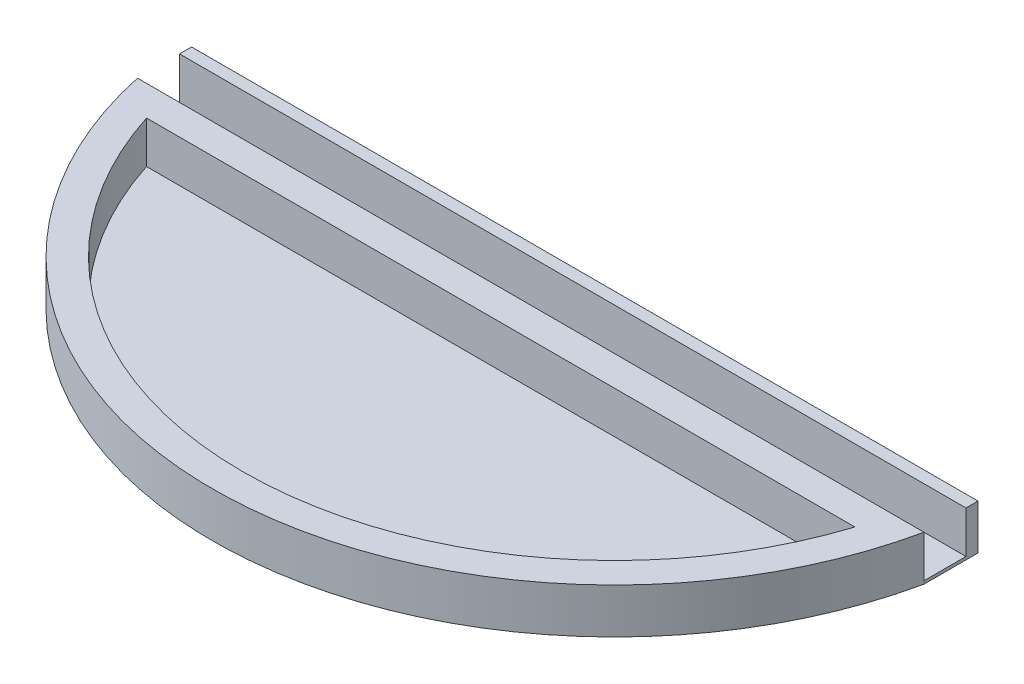
ISO-10303-21;
HEADER;
FILE_DESCRIPTION(('STEP AP214'),'2;1');
FILE_NAME('part.step','',(''),(''),'','','');
FILE_SCHEMA(('AUTOMOTIVE_DESIGN { 1 0 10303 214 1 1 1 1 }'));
ENDSEC;
DATA;
#1=APPLICATION_CONTEXT('core data for automotive mechanical design processes');
#2=APPLICATION_PROTOCOL_DEFINITION('international standard','automotive_design',2000,#1);
#3=PRODUCT_CONTEXT('',#1,'mechanical');
#4=PRODUCT('Part','Part','',(#3));
#5=PRODUCT_RELATED_PRODUCT_CATEGORY('part','',(#4));
#6=PRODUCT_DEFINITION_FORMATION('','',#4);
#7=PRODUCT_DEFINITION_CONTEXT('part definition',#1,'design');
#8=PRODUCT_DEFINITION('design','',#6,#7);
#9=PRODUCT_DEFINITION_SHAPE('','',#8);
#10=(LENGTH_UNIT() NAMED_UNIT(*) SI_UNIT(.MILLI.,.METRE.));
#11=(NAMED_UNIT(*) PLANE_ANGLE_UNIT() SI_UNIT($,.RADIAN.));
#12=(NAMED_UNIT(*) SI_UNIT($,.STERADIAN.) SOLID_ANGLE_UNIT());
#13=UNCERTAINTY_MEASURE_WITH_UNIT(LENGTH_MEASURE(1.E-05),#10,'distance_accuracy_value','');
#14=(GEOMETRIC_REPRESENTATION_CONTEXT(3) GLOBAL_UNCERTAINTY_ASSIGNED_CONTEXT((#13)) GLOBAL_UNIT_ASSIGNED_CONTEXT((#10,
#11,#12)) REPRESENTATION_CONTEXT('',''));
#15=CARTESIAN_POINT('',(0.,0.,0.));
#16=DIRECTION('',(0.,0.,1.));
#17=DIRECTION('',(1.,0.,0.));
#18=AXIS2_PLACEMENT_3D('',#15,#16,#17);
#19=CARTESIAN_POINT('',(0.,7.,-10.4740566037736));
#20=DIRECTION('',(0.,1.,0.));
#21=DIRECTION('',(0.,0.,1.));
#22=AXIS2_PLACEMENT_3D('',#19,#20,#21);
#23=PLANE('',#22);
#24=DIRECTION('',(-1.,0.,0.));
#25=VECTOR('',#24,1.);
#26=CARTESIAN_POINT('',(-64.5,7.,-3.5));
#27=LINE('',#26,#25);
#28=CARTESIAN_POINT('',(65.5,7.,-3.5));
#29=VERTEX_POINT('',#28);
#30=CARTESIAN_POINT('',(-65.5,7.,-3.5));
#31=VERTEX_POINT('',#30);
#32=EDGE_CURVE('E152',#29,#31,#27,.T.);
#33=ORIENTED_EDGE('',*,*,#32,.F.);
#34=DIRECTION('',(0.,0.,-1.));
#35=VECTOR('',#34,1.);
#36=CARTESIAN_POINT('',(65.5,7.,-5.50000000000002));
#37=LINE('',#36,#35);
#38=CARTESIAN_POINT('',(65.5,7.,-5.50000000000002));
#39=VERTEX_POINT('',#38);
#40=EDGE_CURVE('E59',#29,#39,#37,.T.);
#41=ORIENTED_EDGE('',*,*,#40,.T.);
#42=DIRECTION('',(-1.,0.,0.));
#43=VECTOR('',#42,1.);
#44=CARTESIAN_POINT('',(-65.5,7.,-5.5));
#45=LINE('',#44,#43);
#46=CARTESIAN_POINT('',(-65.5,7.,-5.5));
#47=VERTEX_POINT('',#46);
#48=EDGE_CURVE('E157',#39,#47,#45,.T.);
#49=ORIENTED_EDGE('',*,*,#48,.T.);
#50=DIRECTION('',(0.,0.,1.));
#51=VECTOR('',#50,1.);
#52=CARTESIAN_POINT('',(-65.5,7.,-5.5));
#53=LINE('',#52,#51);
#54=EDGE_CURVE('E161',#47,#31,#53,.T.);
#55=ORIENTED_EDGE('',*,*,#54,.T.);
#56=EDGE_LOOP('',(#33,#41,#49,#55));
#57=FACE_BOUND('',#56,.T.);
#58=ADVANCED_FACE('F36',(#57),#23,.T.);
#59=CARTESIAN_POINT('',(0.,7.,-10.4740566037736));
#60=DIRECTION('',(0.,1.,0.));
#61=DIRECTION('',(0.,0.,1.));
#62=AXIS2_PLACEMENT_3D('',#59,#60,#61);
#63=CIRCLE('',#62,61.9740566037736);
#64=CARTESIAN_POINT('',(-58.9980412210823,7.,8.5));
#65=VERTEX_POINT('',#64);
#66=CARTESIAN_POINT('',(58.9980412210823,7.,8.5));
#67=VERTEX_POINT('',#66);
#68=EDGE_CURVE('E51',#65,#67,#63,.T.);
#69=ORIENTED_EDGE('',*,*,#68,.F.);
#70=DIRECTION('',(-1.,0.,0.));
#71=VECTOR('',#70,1.);
#72=CARTESIAN_POINT('',(58.9980412210823,7.,8.5));
#73=LINE('',#72,#71);
#74=EDGE_CURVE('E119',#67,#65,#73,.T.);
#75=ORIENTED_EDGE('',*,*,#74,.F.);
#76=EDGE_LOOP('',(#69,#75));
#77=FACE_BOUND('',#76,.T.);
#78=DIRECTION('',(1.,0.,0.));
#79=VECTOR('',#78,1.);
#80=CARTESIAN_POINT('',(-64.5,7.,3.5));
#81=LINE('',#80,#79);
#82=CARTESIAN_POINT('',(-65.5,7.,3.5));
#83=VERTEX_POINT('',#82);
#84=CARTESIAN_POINT('',(65.5,7.,3.5));
#85=VERTEX_POINT('',#84);
#86=EDGE_CURVE('E154',#83,#85,#81,.T.);
#87=ORIENTED_EDGE('',*,*,#86,.F.);
#88=CARTESIAN_POINT('',(0.,7.,-10.4740566037736));
#89=DIRECTION('',(0.,1.,0.));
#90=DIRECTION('',(0.,0.,1.));
#91=AXIS2_PLACEMENT_3D('',#88,#89,#90);
#92=CIRCLE('',#91,66.9740566037736);
#93=EDGE_CURVE('E164',#83,#85,#92,.T.);
#94=ORIENTED_EDGE('',*,*,#93,.T.);
#95=EDGE_LOOP('',(#87,#94));
#96=FACE_BOUND('',#95,.T.);
#97=ADVANCED_FACE('F201',(#77,#96),#23,.T.);
#98=CARTESIAN_POINT('',(-65.5,7.,-5.5));
#99=DIRECTION('',(0.,0.,1.));
#100=DIRECTION('',(1.,0.,0.));
#101=AXIS2_PLACEMENT_3D('',#98,#99,#100);
#102=PLANE('',#101);
#103=DIRECTION('',(0.,-1.,0.));
#104=VECTOR('',#103,1.);
#105=CARTESIAN_POINT('',(65.5,7.,-5.50000000000002));
#106=LINE('',#105,#104);
#107=CARTESIAN_POINT('',(65.5,-0.5,-5.50000000000002));
#108=VERTEX_POINT('',#107);
#109=EDGE_CURVE('E168',#39,#108,#106,.T.);
#110=ORIENTED_EDGE('',*,*,#109,.T.);
#111=DIRECTION('',(1.,0.,0.));
#112=VECTOR('',#111,1.);
#113=CARTESIAN_POINT('',(-65.5,-0.5,-5.5));
#114=LINE('',#113,#112);
#115=CARTESIAN_POINT('',(-65.5,-0.5,-5.5));
#116=VERTEX_POINT('',#115);
#117=EDGE_CURVE('E142',#116,#108,#114,.T.);
#118=ORIENTED_EDGE('',*,*,#117,.F.);
#119=DIRECTION('',(0.,-1.,0.));
#120=VECTOR('',#119,1.);
#121=CARTESIAN_POINT('',(-65.5,7.,-5.5));
#122=LINE('',#121,#120);
#123=EDGE_CURVE('E11',#47,#116,#122,.T.);
#124=ORIENTED_EDGE('',*,*,#123,.F.);
#125=ORIENTED_EDGE('',*,*,#48,.F.);
#126=EDGE_LOOP('',(#110,#118,#124,#125));
#127=FACE_BOUND('',#126,.T.);
#128=ADVANCED_FACE('F38',(#127),#102,.F.);
#129=CARTESIAN_POINT('',(-65.5,7.,-5.5));
#130=DIRECTION('',(1.,0.,0.));
#131=DIRECTION('',(0.,0.,-1.));
#132=AXIS2_PLACEMENT_3D('',#129,#130,#131);
#133=PLANE('',#132);
#134=DIRECTION('',(0.,0.,1.));
#135=VECTOR('',#134,1.);
#136=CARTESIAN_POINT('',(-65.5,0.,-3.5));
#137=LINE('',#136,#135);
#138=CARTESIAN_POINT('',(-65.5,0.,-3.5));
#139=VERTEX_POINT('',#138);
#140=CARTESIAN_POINT('',(-65.5,0.,3.5));
#141=VERTEX_POINT('',#140);
#142=EDGE_CURVE('E126',#139,#141,#137,.T.);
#143=ORIENTED_EDGE('',*,*,#142,.F.);
#144=DIRECTION('',(0.,1.,0.));
#145=VECTOR('',#144,1.);
#146=CARTESIAN_POINT('',(-65.5,0.,-3.5));
#147=LINE('',#146,#145);
#148=EDGE_CURVE('E134',#139,#31,#147,.T.);
#149=ORIENTED_EDGE('',*,*,#148,.T.);
#150=ORIENTED_EDGE('',*,*,#54,.F.);
#151=ORIENTED_EDGE('',*,*,#123,.T.);
#152=DIRECTION('',(0.,0.,-1.));
#153=VECTOR('',#152,1.);
#154=CARTESIAN_POINT('',(-65.5,-0.5,3.5));
#155=LINE('',#154,#153);
#156=CARTESIAN_POINT('',(-65.5,-0.5,3.50000000000004));
#157=VERTEX_POINT('',#156);
#158=EDGE_CURVE('E137',#157,#116,#155,.T.);
#159=ORIENTED_EDGE('',*,*,#158,.F.);
#160=DIRECTION('',(0.,-1.,0.));
#161=VECTOR('',#160,1.);
#162=CARTESIAN_POINT('',(-65.5,7.,3.5));
#163=LINE('',#162,#161);
#164=EDGE_CURVE('E173',#141,#157,#163,.T.);
#165=ORIENTED_EDGE('',*,*,#164,.F.);
#166=EDGE_LOOP('',(#143,#149,#150,#151,#159,#165));
#167=FACE_BOUND('',#166,.T.);
#168=ADVANCED_FACE('F188',(#167),#133,.F.);
#169=CARTESIAN_POINT('',(0.,7.,-10.4740566037736));
#170=DIRECTION('',(0.,-1.,0.));
#171=DIRECTION('',(0.,0.,-1.));
#172=AXIS2_PLACEMENT_3D('',#169,#170,#171);
#173=CYLINDRICAL_SURFACE('',#172,66.9740566037736);
#174=EDGE_CURVE('E44',#83,#141,#163,.T.);
#175=ORIENTED_EDGE('',*,*,#174,.T.);
#176=ORIENTED_EDGE('',*,*,#164,.T.);
#177=CARTESIAN_POINT('',(0.,-0.5,-10.4740566037736));
#178=DIRECTION('',(0.,-1.,0.));
#179=DIRECTION('',(0.,0.,-1.));
#180=AXIS2_PLACEMENT_3D('',#177,#178,#179);
#181=CIRCLE('',#180,66.9740566037736);
#182=CARTESIAN_POINT('',(65.5,-0.5,3.49999999999997));
#183=VERTEX_POINT('',#182);
#184=EDGE_CURVE('E148',#183,#157,#181,.T.);
#185=ORIENTED_EDGE('',*,*,#184,.F.);
#186=DIRECTION('',(0.,-1.,0.));
#187=VECTOR('',#186,1.);
#188=CARTESIAN_POINT('',(65.5,7.,3.49999999999997));
#189=LINE('',#188,#187);
#190=CARTESIAN_POINT('',(65.5,0.,3.5));
#191=VERTEX_POINT('',#190);
#192=EDGE_CURVE('E170',#191,#183,#189,.T.);
#193=ORIENTED_EDGE('',*,*,#192,.F.);
#194=EDGE_CURVE('E171',#85,#191,#189,.T.);
#195=ORIENTED_EDGE('',*,*,#194,.F.);
#196=ORIENTED_EDGE('',*,*,#93,.F.);
#197=EDGE_LOOP('',(#175,#176,#185,#193,#195,#196));
#198=FACE_BOUND('',#197,.T.);
#199=ADVANCED_FACE('F180',(#198),#173,.T.);
#200=CARTESIAN_POINT('',(65.5,7.,-5.50000000000002));
#201=DIRECTION('',(-1.,0.,0.));
#202=DIRECTION('',(0.,0.,1.));
#203=AXIS2_PLACEMENT_3D('',#200,#201,#202);
#204=PLANE('',#203);
#205=ORIENTED_EDGE('',*,*,#40,.F.);
#206=DIRECTION('',(0.,1.,0.));
#207=VECTOR('',#206,1.);
#208=CARTESIAN_POINT('',(65.5,0.,-3.5));
#209=LINE('',#208,#207);
#210=CARTESIAN_POINT('',(65.5,0.,-3.5));
#211=VERTEX_POINT('',#210);
#212=EDGE_CURVE('E133',#211,#29,#209,.T.);
#213=ORIENTED_EDGE('',*,*,#212,.F.);
#214=DIRECTION('',(0.,0.,-1.));
#215=VECTOR('',#214,1.);
#216=CARTESIAN_POINT('',(65.5,0.,-3.5));
#217=LINE('',#216,#215);
#218=EDGE_CURVE('E130',#191,#211,#217,.T.);
#219=ORIENTED_EDGE('',*,*,#218,.F.);
#220=ORIENTED_EDGE('',*,*,#192,.T.);
#221=DIRECTION('',(0.,0.,1.));
#222=VECTOR('',#221,1.);
#223=CARTESIAN_POINT('',(65.5,-0.5,-5.50000000000002));
#224=LINE('',#223,#222);
#225=EDGE_CURVE('E145',#108,#183,#224,.T.);
#226=ORIENTED_EDGE('',*,*,#225,.F.);
#227=ORIENTED_EDGE('',*,*,#109,.F.);
#228=EDGE_LOOP('',(#205,#213,#219,#220,#226,#227));
#229=FACE_BOUND('',#228,.T.);
#230=ADVANCED_FACE('F194',(#229),#204,.F.);
#231=CARTESIAN_POINT('',(-64.5,7.,-3.5));
#232=DIRECTION('',(0.,0.,1.));
#233=DIRECTION('',(1.,0.,0.));
#234=AXIS2_PLACEMENT_3D('',#231,#232,#233);
#235=PLANE('',#234);
#236=DIRECTION('',(-1.,0.,0.));
#237=VECTOR('',#236,1.);
#238=CARTESIAN_POINT('',(-64.5,0.,-3.5));
#239=LINE('',#238,#237);
#240=EDGE_CURVE('E151',#211,#139,#239,.T.);
#241=ORIENTED_EDGE('',*,*,#240,.F.);
#242=ORIENTED_EDGE('',*,*,#212,.T.);
#243=ORIENTED_EDGE('',*,*,#32,.T.);
#244=ORIENTED_EDGE('',*,*,#148,.F.);
#245=EDGE_LOOP('',(#241,#242,#243,#244));
#246=FACE_BOUND('',#245,.T.);
#247=ADVANCED_FACE('F211',(#246),#235,.T.);
#248=CARTESIAN_POINT('',(-64.5,7.,3.5));
#249=DIRECTION('',(0.,0.,-1.));
#250=DIRECTION('',(-1.,0.,0.));
#251=AXIS2_PLACEMENT_3D('',#248,#249,#250);
#252=PLANE('',#251);
#253=DIRECTION('',(1.,0.,0.));
#254=VECTOR('',#253,1.);
#255=CARTESIAN_POINT('',(-64.5,0.,3.5));
#256=LINE('',#255,#254);
#257=EDGE_CURVE('E155',#141,#191,#256,.T.);
#258=ORIENTED_EDGE('',*,*,#257,.F.);
#259=ORIENTED_EDGE('',*,*,#174,.F.);
#260=ORIENTED_EDGE('',*,*,#86,.T.);
#261=ORIENTED_EDGE('',*,*,#194,.T.);
#262=EDGE_LOOP('',(#258,#259,#260,#261));
#263=FACE_BOUND('',#262,.T.);
#264=ADVANCED_FACE('F199',(#263),#252,.T.);
#265=CARTESIAN_POINT('',(0.,0.,-10.4740566037736));
#266=DIRECTION('',(0.,-1.,0.));
#267=DIRECTION('',(0.,0.,-1.));
#268=AXIS2_PLACEMENT_3D('',#265,#266,#267);
#269=PLANE('',#268);
#270=ORIENTED_EDGE('',*,*,#257,.T.);
#271=ORIENTED_EDGE('',*,*,#218,.T.);
#272=ORIENTED_EDGE('',*,*,#240,.T.);
#273=ORIENTED_EDGE('',*,*,#142,.T.);
#274=EDGE_LOOP('',(#270,#271,#272,#273));
#275=FACE_BOUND('',#274,.T.);
#276=ADVANCED_FACE('F242',(#275),#269,.F.);
#277=CARTESIAN_POINT('',(0.,-0.5,-10.4740566037736));
#278=DIRECTION('',(0.,-1.,0.));
#279=DIRECTION('',(0.,0.,-1.));
#280=AXIS2_PLACEMENT_3D('',#277,#278,#279);
#281=PLANE('',#280);
#282=ORIENTED_EDGE('',*,*,#158,.T.);
#283=ORIENTED_EDGE('',*,*,#117,.T.);
#284=ORIENTED_EDGE('',*,*,#225,.T.);
#285=ORIENTED_EDGE('',*,*,#184,.T.);
#286=EDGE_LOOP('',(#282,#283,#284,#285));
#287=FACE_BOUND('',#286,.T.);
#288=ADVANCED_FACE('F186',(#287),#281,.T.);
#289=CARTESIAN_POINT('',(0.,0.,-10.4740566037736));
#290=DIRECTION('',(0.,1.,0.));
#291=DIRECTION('',(0.,0.,1.));
#292=AXIS2_PLACEMENT_3D('',#289,#290,#291);
#293=CYLINDRICAL_SURFACE('',#292,61.9740566037736);
#294=ORIENTED_EDGE('',*,*,#68,.T.);
#295=DIRECTION('',(0.,1.,0.));
#296=VECTOR('',#295,1.);
#297=CARTESIAN_POINT('',(58.9980412210823,0.,8.5));
#298=LINE('',#297,#296);
#299=CARTESIAN_POINT('',(58.9980412210823,0.,8.5));
#300=VERTEX_POINT('',#299);
#301=EDGE_CURVE('E105',#300,#67,#298,.T.);
#302=ORIENTED_EDGE('',*,*,#301,.F.);
#303=CARTESIAN_POINT('',(0.,0.,-10.4740566037736));
#304=DIRECTION('',(0.,1.,0.));
#305=DIRECTION('',(0.,0.,1.));
#306=AXIS2_PLACEMENT_3D('',#303,#304,#305);
#307=CIRCLE('',#306,61.9740566037736);
#308=CARTESIAN_POINT('',(-58.9980412210823,0.,8.5));
#309=VERTEX_POINT('',#308);
#310=EDGE_CURVE('E108',#309,#300,#307,.T.);
#311=ORIENTED_EDGE('',*,*,#310,.F.);
#312=DIRECTION('',(0.,1.,0.));
#313=VECTOR('',#312,1.);
#314=CARTESIAN_POINT('',(-58.9980412210823,0.,8.5));
#315=LINE('',#314,#313);
#316=EDGE_CURVE('E114',#309,#65,#315,.T.);
#317=ORIENTED_EDGE('',*,*,#316,.T.);
#318=EDGE_LOOP('',(#294,#302,#311,#317));
#319=FACE_BOUND('',#318,.T.);
#320=ADVANCED_FACE('F107',(#319),#293,.F.);
#321=CARTESIAN_POINT('',(58.9980412210823,0.,8.5));
#322=DIRECTION('',(0.,0.,-1.));
#323=DIRECTION('',(-1.,0.,0.));
#324=AXIS2_PLACEMENT_3D('',#321,#322,#323);
#325=PLANE('',#324);
#326=ORIENTED_EDGE('',*,*,#74,.T.);
#327=ORIENTED_EDGE('',*,*,#316,.F.);
#328=DIRECTION('',(-1.,0.,0.));
#329=VECTOR('',#328,1.);
#330=CARTESIAN_POINT('',(58.9980412210823,0.,8.5));
#331=LINE('',#330,#329);
#332=EDGE_CURVE('E115',#300,#309,#331,.T.);
#333=ORIENTED_EDGE('',*,*,#332,.F.);
#334=ORIENTED_EDGE('',*,*,#301,.T.);
#335=EDGE_LOOP('',(#326,#327,#333,#334));
#336=FACE_BOUND('',#335,.T.);
#337=ADVANCED_FACE('F121',(#336),#325,.F.);
#338=CARTESIAN_POINT('',(0.,0.,-10.4740566037736));
#339=DIRECTION('',(0.,1.,0.));
#340=DIRECTION('',(0.,0.,1.));
#341=AXIS2_PLACEMENT_3D('',#338,#339,#340);
#342=PLANE('',#341);
#343=ORIENTED_EDGE('',*,*,#310,.T.);
#344=ORIENTED_EDGE('',*,*,#332,.T.);
#345=EDGE_LOOP('',(#343,#344));
#346=FACE_BOUND('',#345,.T.);
#347=ADVANCED_FACE('F118',(#346),#342,.T.);
#348=CLOSED_SHELL('',(#58,#97,#128,#168,#199,#230,#247,#264,#276,#288,#320,#337,#347));
#349=MANIFOLD_SOLID_BREP('B2',#348);
#350=ADVANCED_BREP_SHAPE_REPRESENTATION('',(#18,#349),#14);
#351=SHAPE_DEFINITION_REPRESENTATION(#9,#350);
ENDSEC;
END-ISO-10303-21;
